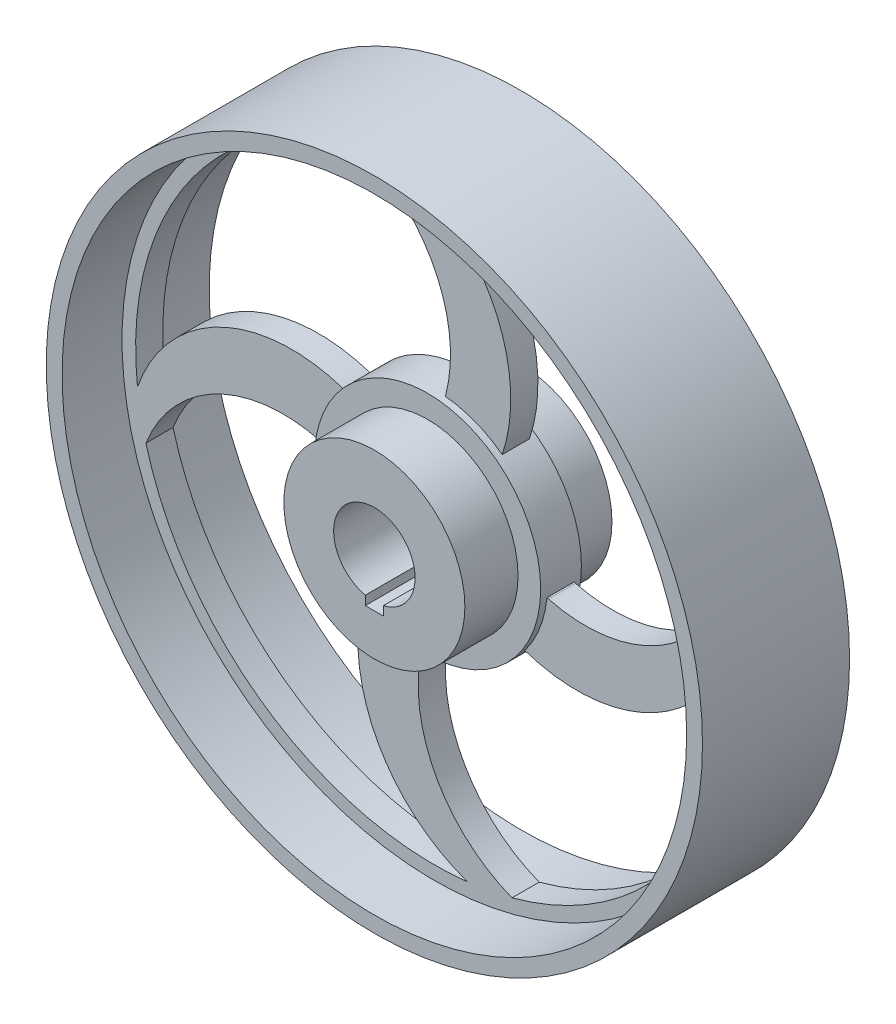
ISO-10303-21;
HEADER;
FILE_DESCRIPTION(('STEP AP214'),'2;1');
FILE_NAME('part.step','',(''),(''),'','','');
FILE_SCHEMA(('AUTOMOTIVE_DESIGN { 1 0 10303 214 1 1 1 1 }'));
ENDSEC;
DATA;
#1=APPLICATION_CONTEXT('core data for automotive mechanical design processes');
#2=APPLICATION_PROTOCOL_DEFINITION('international standard','automotive_design',2000,#1);
#3=PRODUCT_CONTEXT('',#1,'mechanical');
#4=PRODUCT('Part','Part','',(#3));
#5=PRODUCT_RELATED_PRODUCT_CATEGORY('part','',(#4));
#6=PRODUCT_DEFINITION_FORMATION('','',#4);
#7=PRODUCT_DEFINITION_CONTEXT('part definition',#1,'design');
#8=PRODUCT_DEFINITION('design','',#6,#7);
#9=PRODUCT_DEFINITION_SHAPE('','',#8);
#10=(LENGTH_UNIT() NAMED_UNIT(*) SI_UNIT(.MILLI.,.METRE.));
#11=(NAMED_UNIT(*) PLANE_ANGLE_UNIT() SI_UNIT($,.RADIAN.));
#12=(NAMED_UNIT(*) SI_UNIT($,.STERADIAN.) SOLID_ANGLE_UNIT());
#13=UNCERTAINTY_MEASURE_WITH_UNIT(LENGTH_MEASURE(1.E-05),#10,'distance_accuracy_value','');
#14=(GEOMETRIC_REPRESENTATION_CONTEXT(3) GLOBAL_UNCERTAINTY_ASSIGNED_CONTEXT((#13)) GLOBAL_UNIT_ASSIGNED_CONTEXT((#10,
#11,#12)) REPRESENTATION_CONTEXT('',''));
#15=CARTESIAN_POINT('',(0.,0.,0.));
#16=DIRECTION('',(0.,0.,1.));
#17=DIRECTION('',(1.,0.,0.));
#18=AXIS2_PLACEMENT_3D('',#15,#16,#17);
#19=CARTESIAN_POINT('',(0.,0.,152.4));
#20=DIRECTION('',(0.,0.,-1.));
#21=DIRECTION('',(-1.,0.,0.));
#22=AXIS2_PLACEMENT_3D('',#19,#20,#21);
#23=CYLINDRICAL_SURFACE('',#22,3352.8);
#24=CARTESIAN_POINT('',(0.,0.,152.4));
#25=DIRECTION('',(0.,0.,1.));
#26=DIRECTION('',(1.,0.,0.));
#27=AXIS2_PLACEMENT_3D('',#24,#25,#26);
#28=CIRCLE('',#27,3352.8);
#29=CARTESIAN_POINT('',(-872.169182147377,3237.37374390298,152.4));
#30=VERTEX_POINT('',#29);
#31=CARTESIAN_POINT('',(-3331.98089738469,-373.05648293995,152.4));
#32=VERTEX_POINT('',#31);
#33=EDGE_CURVE('E315',#30,#32,#28,.T.);
#34=ORIENTED_EDGE('',*,*,#33,.T.);
#35=DIRECTION('',(0.,0.,-1.));
#36=VECTOR('',#35,1.);
#37=CARTESIAN_POINT('',(-3331.98089738469,-373.05648293995,152.4));
#38=LINE('',#37,#36);
#39=CARTESIAN_POINT('',(-3331.98089738469,-373.05648293995,-152.4));
#40=VERTEX_POINT('',#39);
#41=EDGE_CURVE('E506',#32,#40,#38,.T.);
#42=ORIENTED_EDGE('',*,*,#41,.T.);
#43=CARTESIAN_POINT('',(0.,0.,-152.4));
#44=DIRECTION('',(0.,0.,1.));
#45=DIRECTION('',(1.,0.,0.));
#46=AXIS2_PLACEMENT_3D('',#43,#44,#45);
#47=CIRCLE('',#46,3352.8);
#48=CARTESIAN_POINT('',(-872.169182147377,3237.37374390298,-152.4));
#49=VERTEX_POINT('',#48);
#50=EDGE_CURVE('E321',#49,#40,#47,.T.);
#51=ORIENTED_EDGE('',*,*,#50,.F.);
#52=DIRECTION('',(0.,0.,-1.));
#53=VECTOR('',#52,1.);
#54=CARTESIAN_POINT('',(-872.169182147377,3237.37374390298,152.4));
#55=LINE('',#54,#53);
#56=EDGE_CURVE('E352',#30,#49,#55,.T.);
#57=ORIENTED_EDGE('',*,*,#56,.F.);
#58=EDGE_LOOP('',(#34,#42,#51,#57));
#59=FACE_BOUND('',#58,.T.);
#60=ADVANCED_FACE('F37',(#59),#23,.F.);
#61=CARTESIAN_POINT('',(-3237.37374390299,-872.169182147343,-152.4));
#62=VERTEX_POINT('',#61);
#63=CARTESIAN_POINT('',(373.05648293996,-3331.98089738469,-152.4));
#64=VERTEX_POINT('',#63);
#65=EDGE_CURVE('E323',#62,#64,#47,.T.);
#66=ORIENTED_EDGE('',*,*,#65,.F.);
#67=DIRECTION('',(0.,0.,-1.));
#68=VECTOR('',#67,1.);
#69=CARTESIAN_POINT('',(-3237.37374390299,-872.169182147343,152.4));
#70=LINE('',#69,#68);
#71=CARTESIAN_POINT('',(-3237.37374390299,-872.169182147343,152.4));
#72=VERTEX_POINT('',#71);
#73=EDGE_CURVE('E459',#72,#62,#70,.T.);
#74=ORIENTED_EDGE('',*,*,#73,.F.);
#75=CARTESIAN_POINT('',(373.05648293996,-3331.98089738469,152.4));
#76=VERTEX_POINT('',#75);
#77=EDGE_CURVE('E319',#72,#76,#28,.T.);
#78=ORIENTED_EDGE('',*,*,#77,.T.);
#79=DIRECTION('',(0.,0.,-1.));
#80=VECTOR('',#79,1.);
#81=CARTESIAN_POINT('',(373.05648293996,-3331.98089738469,152.4));
#82=LINE('',#81,#80);
#83=EDGE_CURVE('E222',#76,#64,#82,.T.);
#84=ORIENTED_EDGE('',*,*,#83,.T.);
#85=EDGE_LOOP('',(#66,#74,#78,#84));
#86=FACE_BOUND('',#85,.T.);
#87=ADVANCED_FACE('F423',(#86),#23,.F.);
#88=CARTESIAN_POINT('',(872.169182147354,-3237.37374390298,-152.4));
#89=VERTEX_POINT('',#88);
#90=CARTESIAN_POINT('',(3331.98089738469,373.056482939973,-152.4));
#91=VERTEX_POINT('',#90);
#92=EDGE_CURVE('E446',#89,#91,#47,.T.);
#93=ORIENTED_EDGE('',*,*,#92,.F.);
#94=DIRECTION('',(0.,0.,-1.));
#95=VECTOR('',#94,1.);
#96=CARTESIAN_POINT('',(872.169182147354,-3237.37374390298,152.4));
#97=LINE('',#96,#95);
#98=CARTESIAN_POINT('',(872.169182147354,-3237.37374390298,152.4));
#99=VERTEX_POINT('',#98);
#100=EDGE_CURVE('E235',#99,#89,#97,.T.);
#101=ORIENTED_EDGE('',*,*,#100,.F.);
#102=CARTESIAN_POINT('',(3331.98089738469,373.056482939973,152.4));
#103=VERTEX_POINT('',#102);
#104=EDGE_CURVE('E461',#99,#103,#28,.T.);
#105=ORIENTED_EDGE('',*,*,#104,.T.);
#106=DIRECTION('',(0.,0.,-1.));
#107=VECTOR('',#106,1.);
#108=CARTESIAN_POINT('',(3331.98089738469,373.056482939973,152.4));
#109=LINE('',#108,#107);
#110=EDGE_CURVE('E267',#103,#91,#109,.T.);
#111=ORIENTED_EDGE('',*,*,#110,.T.);
#112=EDGE_LOOP('',(#93,#101,#105,#111));
#113=FACE_BOUND('',#112,.T.);
#114=ADVANCED_FACE('F430',(#113),#23,.F.);
#115=CARTESIAN_POINT('',(3237.37374390298,872.169182147366,-152.4));
#116=VERTEX_POINT('',#115);
#117=CARTESIAN_POINT('',(-373.056482939985,3331.98089738468,-152.4));
#118=VERTEX_POINT('',#117);
#119=EDGE_CURVE('E314',#116,#118,#47,.T.);
#120=ORIENTED_EDGE('',*,*,#119,.F.);
#121=DIRECTION('',(0.,0.,-1.));
#122=VECTOR('',#121,1.);
#123=CARTESIAN_POINT('',(3237.37374390298,872.169182147366,152.4));
#124=LINE('',#123,#122);
#125=CARTESIAN_POINT('',(3237.37374390298,872.169182147366,152.4));
#126=VERTEX_POINT('',#125);
#127=EDGE_CURVE('E270',#126,#116,#124,.T.);
#128=ORIENTED_EDGE('',*,*,#127,.F.);
#129=CARTESIAN_POINT('',(-373.056482939985,3331.98089738468,152.4));
#130=VERTEX_POINT('',#129);
#131=EDGE_CURVE('E320',#126,#130,#28,.T.);
#132=ORIENTED_EDGE('',*,*,#131,.T.);
#133=DIRECTION('',(0.,0.,-1.));
#134=VECTOR('',#133,1.);
#135=CARTESIAN_POINT('',(-373.056482939985,3331.98089738468,152.4));
#136=LINE('',#135,#134);
#137=EDGE_CURVE('E355',#130,#118,#136,.T.);
#138=ORIENTED_EDGE('',*,*,#137,.T.);
#139=EDGE_LOOP('',(#120,#128,#132,#138));
#140=FACE_BOUND('',#139,.T.);
#141=ADVANCED_FACE('F426',(#140),#23,.F.);
#142=CARTESIAN_POINT('',(0.,0.,228.6));
#143=DIRECTION('',(0.,0.,-1.));
#144=DIRECTION('',(-1.,0.,0.));
#145=AXIS2_PLACEMENT_3D('',#142,#143,#144);
#146=CYLINDRICAL_SURFACE('',#145,1270.);
#147=DIRECTION('',(0.,0.,-1.));
#148=VECTOR('',#147,1.);
#149=CARTESIAN_POINT('',(-1015.99999999999,762.00000000001,152.4));
#150=LINE('',#149,#148);
#151=CARTESIAN_POINT('',(-1015.99999999999,762.00000000001,152.4));
#152=VERTEX_POINT('',#151);
#153=CARTESIAN_POINT('',(-1015.99999999999,762.000000000011,-152.4));
#154=VERTEX_POINT('',#153);
#155=EDGE_CURVE('E52',#152,#154,#150,.T.);
#156=ORIENTED_EDGE('',*,*,#155,.F.);
#157=CARTESIAN_POINT('',(-8.88178419700125E-13,0.,152.4));
#158=DIRECTION('',(0.,0.,-1.));
#159=DIRECTION('',(1.,0.,0.));
#160=AXIS2_PLACEMENT_3D('',#157,#158,#159);
#161=CIRCLE('',#160,1270.);
#162=CARTESIAN_POINT('',(-1263.93009157304,124.019045376743,152.4));
#163=VERTEX_POINT('',#162);
#164=EDGE_CURVE('E57',#163,#152,#161,.T.);
#165=ORIENTED_EDGE('',*,*,#164,.F.);
#166=DIRECTION('',(0.,0.,-1.));
#167=VECTOR('',#166,1.);
#168=CARTESIAN_POINT('',(-1263.93009157304,124.019045376743,152.4));
#169=LINE('',#168,#167);
#170=CARTESIAN_POINT('',(-1263.93009157304,124.019045376743,-152.4));
#171=VERTEX_POINT('',#170);
#172=EDGE_CURVE('E195',#163,#171,#169,.T.);
#173=ORIENTED_EDGE('',*,*,#172,.T.);
#174=CARTESIAN_POINT('',(-8.88178419700125E-13,0.,-152.4));
#175=DIRECTION('',(0.,0.,-1.));
#176=DIRECTION('',(1.,0.,0.));
#177=AXIS2_PLACEMENT_3D('',#174,#175,#176);
#178=CIRCLE('',#177,1270.);
#179=EDGE_CURVE('E199',#171,#154,#178,.T.);
#180=ORIENTED_EDGE('',*,*,#179,.T.);
#181=EDGE_LOOP('',(#156,#165,#173,#180));
#182=FACE_BOUND('',#181,.T.);
#183=DIRECTION('',(0.,0.,-1.));
#184=VECTOR('',#183,1.);
#185=CARTESIAN_POINT('',(-762.000000000007,-1015.99999999999,152.4));
#186=LINE('',#185,#184);
#187=CARTESIAN_POINT('',(-762.000000000007,-1015.99999999999,152.4));
#188=VERTEX_POINT('',#187);
#189=CARTESIAN_POINT('',(-762.000000000008,-1015.99999999999,-152.4));
#190=VERTEX_POINT('',#189);
#191=EDGE_CURVE('E219',#188,#190,#186,.T.);
#192=ORIENTED_EDGE('',*,*,#191,.F.);
#193=CARTESIAN_POINT('',(-8.88178419700125E-13,0.,152.4));
#194=DIRECTION('',(0.,0.,-1.));
#195=DIRECTION('',(1.,0.,0.));
#196=AXIS2_PLACEMENT_3D('',#193,#194,#195);
#197=CIRCLE('',#196,1270.);
#198=CARTESIAN_POINT('',(-124.019045376738,-1263.93009157304,152.4));
#199=VERTEX_POINT('',#198);
#200=EDGE_CURVE('E248',#199,#188,#197,.T.);
#201=ORIENTED_EDGE('',*,*,#200,.F.);
#202=DIRECTION('',(0.,0.,-1.));
#203=VECTOR('',#202,1.);
#204=CARTESIAN_POINT('',(-124.019045376738,-1263.93009157304,152.4));
#205=LINE('',#204,#203);
#206=CARTESIAN_POINT('',(-124.019045376738,-1263.93009157304,-152.4));
#207=VERTEX_POINT('',#206);
#208=EDGE_CURVE('E241',#199,#207,#205,.T.);
#209=ORIENTED_EDGE('',*,*,#208,.T.);
#210=CARTESIAN_POINT('',(-8.88178419700125E-13,0.,-152.4));
#211=DIRECTION('',(0.,0.,-1.));
#212=DIRECTION('',(1.,0.,0.));
#213=AXIS2_PLACEMENT_3D('',#210,#211,#212);
#214=CIRCLE('',#213,1270.);
#215=EDGE_CURVE('E253',#207,#190,#214,.T.);
#216=ORIENTED_EDGE('',*,*,#215,.T.);
#217=EDGE_LOOP('',(#192,#201,#209,#216));
#218=FACE_BOUND('',#217,.T.);
#219=DIRECTION('',(0.,0.,-1.));
#220=VECTOR('',#219,1.);
#221=CARTESIAN_POINT('',(1016.,-762.000000000004,152.4));
#222=LINE('',#221,#220);
#223=CARTESIAN_POINT('',(1016.,-762.000000000004,152.4));
#224=VERTEX_POINT('',#223);
#225=CARTESIAN_POINT('',(1016.,-762.000000000004,-152.4));
#226=VERTEX_POINT('',#225);
#227=EDGE_CURVE('E255',#224,#226,#222,.T.);
#228=ORIENTED_EDGE('',*,*,#227,.F.);
#229=CARTESIAN_POINT('',(-8.88178419700125E-13,0.,152.4));
#230=DIRECTION('',(0.,0.,-1.));
#231=DIRECTION('',(1.,0.,0.));
#232=AXIS2_PLACEMENT_3D('',#229,#230,#231);
#233=CIRCLE('',#232,1270.);
#234=CARTESIAN_POINT('',(1263.93009157304,-124.019045376734,152.4));
#235=VERTEX_POINT('',#234);
#236=EDGE_CURVE('E283',#235,#224,#233,.T.);
#237=ORIENTED_EDGE('',*,*,#236,.F.);
#238=DIRECTION('',(0.,0.,-1.));
#239=VECTOR('',#238,1.);
#240=CARTESIAN_POINT('',(1263.93009157304,-124.019045376734,152.4));
#241=LINE('',#240,#239);
#242=CARTESIAN_POINT('',(1263.93009157304,-124.019045376734,-152.4));
#243=VERTEX_POINT('',#242);
#244=EDGE_CURVE('E276',#235,#243,#241,.T.);
#245=ORIENTED_EDGE('',*,*,#244,.T.);
#246=CARTESIAN_POINT('',(-8.88178419700125E-13,0.,-152.4));
#247=DIRECTION('',(0.,0.,-1.));
#248=DIRECTION('',(1.,0.,0.));
#249=AXIS2_PLACEMENT_3D('',#246,#247,#248);
#250=CIRCLE('',#249,1270.);
#251=EDGE_CURVE('E288',#243,#226,#250,.T.);
#252=ORIENTED_EDGE('',*,*,#251,.T.);
#253=EDGE_LOOP('',(#228,#237,#245,#252));
#254=FACE_BOUND('',#253,.T.);
#255=DIRECTION('',(0.,0.,-1.));
#256=VECTOR('',#255,1.);
#257=CARTESIAN_POINT('',(762.,1016.,152.4));
#258=LINE('',#257,#256);
#259=CARTESIAN_POINT('',(762.,1016.,152.4));
#260=VERTEX_POINT('',#259);
#261=CARTESIAN_POINT('',(762.,1016.,-152.4));
#262=VERTEX_POINT('',#261);
#263=EDGE_CURVE('E358',#260,#262,#258,.T.);
#264=ORIENTED_EDGE('',*,*,#263,.F.);
#265=CARTESIAN_POINT('',(-8.88178419700125E-13,0.,152.4));
#266=DIRECTION('',(0.,0.,-1.));
#267=DIRECTION('',(1.,0.,0.));
#268=AXIS2_PLACEMENT_3D('',#265,#266,#267);
#269=CIRCLE('',#268,1270.);
#270=CARTESIAN_POINT('',(124.01904537673,1263.93009157304,152.4));
#271=VERTEX_POINT('',#270);
#272=EDGE_CURVE('E327',#271,#260,#269,.T.);
#273=ORIENTED_EDGE('',*,*,#272,.F.);
#274=DIRECTION('',(0.,0.,-1.));
#275=VECTOR('',#274,1.);
#276=CARTESIAN_POINT('',(124.01904537673,1263.93009157304,152.4));
#277=LINE('',#276,#275);
#278=CARTESIAN_POINT('',(124.01904537673,1263.93009157304,-152.4));
#279=VERTEX_POINT('',#278);
#280=EDGE_CURVE('E339',#271,#279,#277,.T.);
#281=ORIENTED_EDGE('',*,*,#280,.T.);
#282=CARTESIAN_POINT('',(-8.88178419700125E-13,0.,-152.4));
#283=DIRECTION('',(0.,0.,-1.));
#284=DIRECTION('',(1.,0.,0.));
#285=AXIS2_PLACEMENT_3D('',#282,#283,#284);
#286=CIRCLE('',#285,1270.);
#287=EDGE_CURVE('E326',#279,#262,#286,.T.);
#288=ORIENTED_EDGE('',*,*,#287,.T.);
#289=EDGE_LOOP('',(#264,#273,#281,#288));
#290=FACE_BOUND('',#289,.T.);
#291=CARTESIAN_POINT('',(0.,0.,228.6));
#292=DIRECTION('',(0.,0.,1.));
#293=DIRECTION('',(1.,0.,0.));
#294=AXIS2_PLACEMENT_3D('',#291,#292,#293);
#295=CIRCLE('',#294,1270.);
#296=CARTESIAN_POINT('',(1270.,0.,228.6));
#297=VERTEX_POINT('',#296);
#298=EDGE_CURVE('E45',#297,#297,#295,.T.);
#299=ORIENTED_EDGE('',*,*,#298,.F.);
#300=EDGE_LOOP('',(#299));
#301=FACE_BOUND('',#300,.T.);
#302=CARTESIAN_POINT('',(0.,0.,-228.6));
#303=DIRECTION('',(0.,0.,1.));
#304=DIRECTION('',(1.,0.,0.));
#305=AXIS2_PLACEMENT_3D('',#302,#303,#304);
#306=CIRCLE('',#305,1270.);
#307=CARTESIAN_POINT('',(1270.,0.,-228.6));
#308=VERTEX_POINT('',#307);
#309=EDGE_CURVE('E401',#308,#308,#306,.T.);
#310=ORIENTED_EDGE('',*,*,#309,.T.);
#311=EDGE_LOOP('',(#310));
#312=FACE_BOUND('',#311,.T.);
#313=ADVANCED_FACE('F39',(#182,#218,#254,#290,#301,#312),#146,.T.);
#314=CARTESIAN_POINT('',(0.,0.,228.6));
#315=DIRECTION('',(0.,0.,1.));
#316=DIRECTION('',(1.,0.,0.));
#317=AXIS2_PLACEMENT_3D('',#314,#315,#316);
#318=PLANE('',#317);
#319=CARTESIAN_POINT('',(0.,0.,228.6));
#320=DIRECTION('',(0.,0.,1.));
#321=DIRECTION('',(1.,0.,0.));
#322=AXIS2_PLACEMENT_3D('',#319,#320,#321);
#323=CIRCLE('',#322,1016.);
#324=CARTESIAN_POINT('',(1016.,0.,228.6));
#325=VERTEX_POINT('',#324);
#326=EDGE_CURVE('E396',#325,#325,#323,.F.);
#327=ORIENTED_EDGE('',*,*,#326,.T.);
#328=EDGE_LOOP('',(#327));
#329=FACE_BOUND('',#328,.T.);
#330=ORIENTED_EDGE('',*,*,#298,.T.);
#331=EDGE_LOOP('',(#330));
#332=FACE_BOUND('',#331,.T.);
#333=ADVANCED_FACE('F410',(#329,#332),#318,.T.);
#334=CARTESIAN_POINT('',(0.,0.,-228.6));
#335=DIRECTION('',(0.,0.,1.));
#336=DIRECTION('',(1.,0.,0.));
#337=AXIS2_PLACEMENT_3D('',#334,#335,#336);
#338=PLANE('',#337);
#339=CARTESIAN_POINT('',(0.,0.,-228.6));
#340=DIRECTION('',(0.,0.,1.));
#341=DIRECTION('',(1.,0.,0.));
#342=AXIS2_PLACEMENT_3D('',#339,#340,#341);
#343=CIRCLE('',#342,1016.);
#344=CARTESIAN_POINT('',(1016.,0.,-228.6));
#345=VERTEX_POINT('',#344);
#346=EDGE_CURVE('E11',#345,#345,#343,.F.);
#347=ORIENTED_EDGE('',*,*,#346,.F.);
#348=EDGE_LOOP('',(#347));
#349=FACE_BOUND('',#348,.T.);
#350=ORIENTED_EDGE('',*,*,#309,.F.);
#351=EDGE_LOOP('',(#350));
#352=FACE_BOUND('',#351,.T.);
#353=ADVANCED_FACE('F407',(#349,#352),#338,.F.);
#354=CARTESIAN_POINT('',(0.,0.,-825.5));
#355=DIRECTION('',(0.,0.,1.));
#356=DIRECTION('',(1.,0.,0.));
#357=AXIS2_PLACEMENT_3D('',#354,#355,#356);
#358=PLANE('',#357);
#359=DIRECTION('',(-1.,0.,0.));
#360=VECTOR('',#359,1.);
#361=CARTESIAN_POINT('',(101.6,-547.36819087952,-825.5));
#362=LINE('',#361,#360);
#363=CARTESIAN_POINT('',(101.6,-547.36819087952,-825.5));
#364=VERTEX_POINT('',#363);
#365=CARTESIAN_POINT('',(-101.6,-547.36819087952,-825.5));
#366=VERTEX_POINT('',#365);
#367=EDGE_CURVE('E372',#364,#366,#362,.T.);
#368=ORIENTED_EDGE('',*,*,#367,.F.);
#369=DIRECTION('',(0.,1.,0.));
#370=VECTOR('',#369,1.);
#371=CARTESIAN_POINT('',(101.6,-547.36819087952,-825.5));
#372=LINE('',#371,#370);
#373=CARTESIAN_POINT('',(101.6,-445.76819087952,-825.5));
#374=VERTEX_POINT('',#373);
#375=EDGE_CURVE('E362',#364,#374,#372,.T.);
#376=ORIENTED_EDGE('',*,*,#375,.T.);
#377=CARTESIAN_POINT('',(0.,0.,-825.5));
#378=DIRECTION('',(0.,0.,1.));
#379=DIRECTION('',(1.,0.,0.));
#380=AXIS2_PLACEMENT_3D('',#377,#378,#379);
#381=CIRCLE('',#380,457.2);
#382=CARTESIAN_POINT('',(-101.600000000001,-445.76819087952,-825.5));
#383=VERTEX_POINT('',#382);
#384=EDGE_CURVE('E365',#374,#383,#381,.T.);
#385=ORIENTED_EDGE('',*,*,#384,.T.);
#386=DIRECTION('',(0.,1.,0.));
#387=VECTOR('',#386,1.);
#388=CARTESIAN_POINT('',(-101.6,-547.36819087952,-825.5));
#389=LINE('',#388,#387);
#390=EDGE_CURVE('E369',#366,#383,#389,.T.);
#391=ORIENTED_EDGE('',*,*,#390,.F.);
#392=EDGE_LOOP('',(#368,#376,#385,#391));
#393=FACE_BOUND('',#392,.T.);
#394=CARTESIAN_POINT('',(0.,0.,-825.5));
#395=DIRECTION('',(0.,0.,1.));
#396=DIRECTION('',(1.,0.,0.));
#397=AXIS2_PLACEMENT_3D('',#394,#395,#396);
#398=CIRCLE('',#397,1016.);
#399=CARTESIAN_POINT('',(1016.,0.,-825.5));
#400=VERTEX_POINT('',#399);
#401=EDGE_CURVE('E386',#400,#400,#398,.T.);
#402=ORIENTED_EDGE('',*,*,#401,.F.);
#403=EDGE_LOOP('',(#402));
#404=FACE_BOUND('',#403,.T.);
#405=ADVANCED_FACE('F409',(#393,#404),#358,.F.);
#406=CARTESIAN_POINT('',(0.,0.,825.5));
#407=DIRECTION('',(0.,0.,-1.));
#408=DIRECTION('',(-1.,0.,0.));
#409=AXIS2_PLACEMENT_3D('',#406,#407,#408);
#410=CYLINDRICAL_SURFACE('',#409,1016.);
#411=ORIENTED_EDGE('',*,*,#401,.T.);
#412=EDGE_LOOP('',(#411));
#413=FACE_BOUND('',#412,.T.);
#414=ORIENTED_EDGE('',*,*,#346,.T.);
#415=EDGE_LOOP('',(#414));
#416=FACE_BOUND('',#415,.T.);
#417=ADVANCED_FACE('F416',(#413,#416),#410,.T.);
#418=ORIENTED_EDGE('',*,*,#326,.F.);
#419=EDGE_LOOP('',(#418));
#420=FACE_BOUND('',#419,.T.);
#421=CARTESIAN_POINT('',(0.,0.,825.5));
#422=DIRECTION('',(0.,0.,1.));
#423=DIRECTION('',(1.,0.,0.));
#424=AXIS2_PLACEMENT_3D('',#421,#422,#423);
#425=CIRCLE('',#424,1016.);
#426=CARTESIAN_POINT('',(1016.,0.,825.5));
#427=VERTEX_POINT('',#426);
#428=EDGE_CURVE('E393',#427,#427,#425,.T.);
#429=ORIENTED_EDGE('',*,*,#428,.F.);
#430=EDGE_LOOP('',(#429));
#431=FACE_BOUND('',#430,.T.);
#432=ADVANCED_FACE('F592',(#420,#431),#410,.T.);
#433=CARTESIAN_POINT('',(0.,0.,825.5));
#434=DIRECTION('',(0.,0.,1.));
#435=DIRECTION('',(1.,0.,0.));
#436=AXIS2_PLACEMENT_3D('',#433,#434,#435);
#437=PLANE('',#436);
#438=DIRECTION('',(0.,1.,0.));
#439=VECTOR('',#438,1.);
#440=CARTESIAN_POINT('',(101.6,-547.36819087952,825.5));
#441=LINE('',#440,#439);
#442=CARTESIAN_POINT('',(101.6,-547.36819087952,825.5));
#443=VERTEX_POINT('',#442);
#444=CARTESIAN_POINT('',(101.6,-445.76819087952,825.5));
#445=VERTEX_POINT('',#444);
#446=EDGE_CURVE('E361',#443,#445,#441,.T.);
#447=ORIENTED_EDGE('',*,*,#446,.F.);
#448=DIRECTION('',(-1.,0.,0.));
#449=VECTOR('',#448,1.);
#450=CARTESIAN_POINT('',(101.6,-547.36819087952,825.5));
#451=LINE('',#450,#449);
#452=CARTESIAN_POINT('',(-101.6,-547.36819087952,825.5));
#453=VERTEX_POINT('',#452);
#454=EDGE_CURVE('E366',#443,#453,#451,.T.);
#455=ORIENTED_EDGE('',*,*,#454,.T.);
#456=DIRECTION('',(0.,1.,0.));
#457=VECTOR('',#456,1.);
#458=CARTESIAN_POINT('',(-101.6,-547.36819087952,825.5));
#459=LINE('',#458,#457);
#460=CARTESIAN_POINT('',(-101.600000000001,-445.76819087952,825.5));
#461=VERTEX_POINT('',#460);
#462=EDGE_CURVE('E379',#453,#461,#459,.T.);
#463=ORIENTED_EDGE('',*,*,#462,.T.);
#464=CARTESIAN_POINT('',(0.,0.,825.5));
#465=DIRECTION('',(0.,0.,1.));
#466=DIRECTION('',(1.,0.,0.));
#467=AXIS2_PLACEMENT_3D('',#464,#465,#466);
#468=CIRCLE('',#467,457.2);
#469=EDGE_CURVE('E376',#445,#461,#468,.T.);
#470=ORIENTED_EDGE('',*,*,#469,.F.);
#471=EDGE_LOOP('',(#447,#455,#463,#470));
#472=FACE_BOUND('',#471,.T.);
#473=ORIENTED_EDGE('',*,*,#428,.T.);
#474=EDGE_LOOP('',(#473));
#475=FACE_BOUND('',#474,.T.);
#476=ADVANCED_FACE('F589',(#472,#475),#437,.T.);
#477=CARTESIAN_POINT('',(101.6,-547.36819087952,-825.5));
#478=DIRECTION('',(1.,0.,0.));
#479=DIRECTION('',(0.,1.,0.));
#480=AXIS2_PLACEMENT_3D('',#477,#478,#479);
#481=PLANE('',#480);
#482=ORIENTED_EDGE('',*,*,#446,.T.);
#483=DIRECTION('',(0.,0.,1.));
#484=VECTOR('',#483,1.);
#485=CARTESIAN_POINT('',(101.6,-445.76819087952,-825.5));
#486=LINE('',#485,#484);
#487=EDGE_CURVE('E374',#374,#445,#486,.T.);
#488=ORIENTED_EDGE('',*,*,#487,.F.);
#489=ORIENTED_EDGE('',*,*,#375,.F.);
#490=DIRECTION('',(0.,0.,1.));
#491=VECTOR('',#490,1.);
#492=CARTESIAN_POINT('',(101.6,-547.36819087952,-825.5));
#493=LINE('',#492,#491);
#494=EDGE_CURVE('E384',#364,#443,#493,.T.);
#495=ORIENTED_EDGE('',*,*,#494,.T.);
#496=EDGE_LOOP('',(#482,#488,#489,#495));
#497=FACE_BOUND('',#496,.T.);
#498=ADVANCED_FACE('F579',(#497),#481,.F.);
#499=CARTESIAN_POINT('',(101.6,-547.36819087952,-825.5));
#500=DIRECTION('',(0.,1.,0.));
#501=DIRECTION('',(-1.,0.,0.));
#502=AXIS2_PLACEMENT_3D('',#499,#500,#501);
#503=PLANE('',#502);
#504=ORIENTED_EDGE('',*,*,#454,.F.);
#505=ORIENTED_EDGE('',*,*,#494,.F.);
#506=ORIENTED_EDGE('',*,*,#367,.T.);
#507=DIRECTION('',(0.,0.,1.));
#508=VECTOR('',#507,1.);
#509=CARTESIAN_POINT('',(-101.6,-547.36819087952,-825.5));
#510=LINE('',#509,#508);
#511=EDGE_CURVE('E387',#366,#453,#510,.T.);
#512=ORIENTED_EDGE('',*,*,#511,.T.);
#513=EDGE_LOOP('',(#504,#505,#506,#512));
#514=FACE_BOUND('',#513,.T.);
#515=ADVANCED_FACE('F575',(#514),#503,.T.);
#516=CARTESIAN_POINT('',(-101.6,-547.36819087952,-825.5));
#517=DIRECTION('',(1.,0.,0.));
#518=DIRECTION('',(0.,1.,0.));
#519=AXIS2_PLACEMENT_3D('',#516,#517,#518);
#520=PLANE('',#519);
#521=ORIENTED_EDGE('',*,*,#462,.F.);
#522=ORIENTED_EDGE('',*,*,#511,.F.);
#523=ORIENTED_EDGE('',*,*,#390,.T.);
#524=DIRECTION('',(0.,0.,1.));
#525=VECTOR('',#524,1.);
#526=CARTESIAN_POINT('',(-101.600000000001,-445.76819087952,-825.5));
#527=LINE('',#526,#525);
#528=EDGE_CURVE('E389',#383,#461,#527,.T.);
#529=ORIENTED_EDGE('',*,*,#528,.T.);
#530=EDGE_LOOP('',(#521,#522,#523,#529));
#531=FACE_BOUND('',#530,.T.);
#532=ADVANCED_FACE('F578',(#531),#520,.T.);
#533=CARTESIAN_POINT('',(0.,0.,-825.5));
#534=DIRECTION('',(0.,0.,1.));
#535=DIRECTION('',(1.,0.,0.));
#536=AXIS2_PLACEMENT_3D('',#533,#534,#535);
#537=CYLINDRICAL_SURFACE('',#536,457.2);
#538=ORIENTED_EDGE('',*,*,#469,.T.);
#539=ORIENTED_EDGE('',*,*,#528,.F.);
#540=ORIENTED_EDGE('',*,*,#384,.F.);
#541=ORIENTED_EDGE('',*,*,#487,.T.);
#542=EDGE_LOOP('',(#538,#539,#540,#541));
#543=FACE_BOUND('',#542,.T.);
#544=ADVANCED_FACE('F574',(#543),#537,.F.);
#545=CARTESIAN_POINT('',(-974.188725536605,1601.23284939887,152.4));
#546=DIRECTION('',(0.,0.,-1.));
#547=DIRECTION('',(-1.,0.,0.));
#548=AXIS2_PLACEMENT_3D('',#545,#546,#547);
#549=CYLINDRICAL_SURFACE('',#548,1832.17051026807);
#550=CARTESIAN_POINT('',(-974.188725536605,1601.23284939887,-152.4));
#551=DIRECTION('',(0.,0.,1.));
#552=DIRECTION('',(-1.,0.,0.));
#553=AXIS2_PLACEMENT_3D('',#550,#551,#552);
#554=CIRCLE('',#553,1832.17051026807);
#555=EDGE_CURVE('E341',#262,#118,#554,.T.);
#556=ORIENTED_EDGE('',*,*,#555,.T.);
#557=ORIENTED_EDGE('',*,*,#137,.F.);
#558=CARTESIAN_POINT('',(-974.188725536605,1601.23284939887,152.4));
#559=DIRECTION('',(0.,0.,1.));
#560=DIRECTION('',(-1.,0.,0.));
#561=AXIS2_PLACEMENT_3D('',#558,#559,#560);
#562=CIRCLE('',#561,1832.17051026807);
#563=EDGE_CURVE('E330',#260,#130,#562,.T.);
#564=ORIENTED_EDGE('',*,*,#563,.F.);
#565=ORIENTED_EDGE('',*,*,#263,.T.);
#566=EDGE_LOOP('',(#556,#557,#564,#565));
#567=FACE_BOUND('',#566,.T.);
#568=ADVANCED_FACE('F491',(#567),#549,.T.);
#569=CARTESIAN_POINT('',(-1473.30134449858,1695.84042622503,152.4));
#570=DIRECTION('',(0.,0.,-1.));
#571=DIRECTION('',(-1.,0.,0.));
#572=AXIS2_PLACEMENT_3D('',#569,#570,#571);
#573=CYLINDRICAL_SURFACE('',#572,1654.59507013777);
#574=CARTESIAN_POINT('',(-1473.30134449858,1695.84042622503,-152.4));
#575=DIRECTION('',(0.,0.,-1.));
#576=DIRECTION('',(-1.,0.,0.));
#577=AXIS2_PLACEMENT_3D('',#574,#575,#576);
#578=CIRCLE('',#577,1654.59507013777);
#579=CARTESIAN_POINT('',(128.323732845128,1280.53095396613,-152.4));
#580=VERTEX_POINT('',#579);
#581=EDGE_CURVE('E344',#49,#580,#578,.T.);
#582=ORIENTED_EDGE('',*,*,#581,.T.);
#583=DIRECTION('',(0.,0.,-1.));
#584=VECTOR('',#583,1.);
#585=CARTESIAN_POINT('',(128.323732845128,1280.53095396613,152.4));
#586=LINE('',#585,#584);
#587=CARTESIAN_POINT('',(128.323732845128,1280.53095396613,152.4));
#588=VERTEX_POINT('',#587);
#589=EDGE_CURVE('E349',#588,#580,#586,.T.);
#590=ORIENTED_EDGE('',*,*,#589,.F.);
#591=CARTESIAN_POINT('',(-1473.30134449858,1695.84042622503,152.4));
#592=DIRECTION('',(0.,0.,-1.));
#593=DIRECTION('',(-1.,0.,0.));
#594=AXIS2_PLACEMENT_3D('',#591,#592,#593);
#595=CIRCLE('',#594,1654.59507013777);
#596=EDGE_CURVE('E334',#30,#588,#595,.T.);
#597=ORIENTED_EDGE('',*,*,#596,.F.);
#598=ORIENTED_EDGE('',*,*,#56,.T.);
#599=EDGE_LOOP('',(#582,#590,#597,#598));
#600=FACE_BOUND('',#599,.T.);
#601=ADVANCED_FACE('F500',(#600),#573,.F.);
#602=CARTESIAN_POINT('',(128.323732845128,1280.53095396613,152.4));
#603=DIRECTION('',(0.967986129204623,-0.251003692537483,0.));
#604=DIRECTION('',(0.251003692537483,0.967986129204623,0.));
#605=AXIS2_PLACEMENT_3D('',#602,#603,#604);
#606=PLANE('',#605);
#607=DIRECTION('',(-0.251003692537483,-0.967986129204623,0.));
#608=VECTOR('',#607,1.);
#609=CARTESIAN_POINT('',(128.323732845128,1280.53095396613,-152.4));
#610=LINE('',#609,#608);
#611=EDGE_CURVE('E331',#580,#279,#610,.T.);
#612=ORIENTED_EDGE('',*,*,#611,.T.);
#613=ORIENTED_EDGE('',*,*,#280,.F.);
#614=DIRECTION('',(-0.251003692537483,-0.967986129204623,0.));
#615=VECTOR('',#614,1.);
#616=CARTESIAN_POINT('',(128.323732845128,1280.53095396613,152.4));
#617=LINE('',#616,#615);
#618=EDGE_CURVE('E336',#588,#271,#617,.T.);
#619=ORIENTED_EDGE('',*,*,#618,.F.);
#620=ORIENTED_EDGE('',*,*,#589,.T.);
#621=EDGE_LOOP('',(#612,#613,#619,#620));
#622=FACE_BOUND('',#621,.T.);
#623=ADVANCED_FACE('F497',(#622),#606,.F.);
#624=CARTESIAN_POINT('',(-8.88178419700125E-13,0.,152.4));
#625=DIRECTION('',(0.,0.,1.));
#626=DIRECTION('',(1.,0.,0.));
#627=AXIS2_PLACEMENT_3D('',#624,#625,#626);
#628=PLANE('',#627);
#629=ORIENTED_EDGE('',*,*,#272,.T.);
#630=ORIENTED_EDGE('',*,*,#563,.T.);
#631=ORIENTED_EDGE('',*,*,#131,.F.);
#632=CARTESIAN_POINT('',(1695.84042622504,1473.30134449857,152.4));
#633=DIRECTION('',(0.,0.,-1.));
#634=DIRECTION('',(-1.,0.,0.));
#635=AXIS2_PLACEMENT_3D('',#632,#633,#634);
#636=CIRCLE('',#635,1654.59507013777);
#637=CARTESIAN_POINT('',(1280.53095396613,-128.323732845133,152.4));
#638=VERTEX_POINT('',#637);
#639=EDGE_CURVE('E293',#126,#638,#636,.T.);
#640=ORIENTED_EDGE('',*,*,#639,.T.);
#641=DIRECTION('',(-0.967986129204622,0.251003692537486,0.));
#642=VECTOR('',#641,1.);
#643=CARTESIAN_POINT('',(1280.53095396613,-128.323732845133,152.4));
#644=LINE('',#643,#642);
#645=EDGE_CURVE('E278',#638,#235,#644,.T.);
#646=ORIENTED_EDGE('',*,*,#645,.T.);
#647=ORIENTED_EDGE('',*,*,#236,.T.);
#648=CARTESIAN_POINT('',(1601.23284939888,974.188725536599,152.4));
#649=DIRECTION('',(0.,0.,1.));
#650=DIRECTION('',(-1.,0.,0.));
#651=AXIS2_PLACEMENT_3D('',#648,#649,#650);
#652=CIRCLE('',#651,1832.17051026807);
#653=EDGE_CURVE('E295',#224,#103,#652,.T.);
#654=ORIENTED_EDGE('',*,*,#653,.T.);
#655=ORIENTED_EDGE('',*,*,#104,.F.);
#656=CARTESIAN_POINT('',(1473.30134449857,-1695.84042622504,152.4));
#657=DIRECTION('',(0.,0.,-1.));
#658=DIRECTION('',(-1.,0.,0.));
#659=AXIS2_PLACEMENT_3D('',#656,#657,#658);
#660=CIRCLE('',#659,1654.59507013777);
#661=CARTESIAN_POINT('',(-128.323732845137,-1280.53095396613,152.4));
#662=VERTEX_POINT('',#661);
#663=EDGE_CURVE('E258',#99,#662,#660,.T.);
#664=ORIENTED_EDGE('',*,*,#663,.T.);
#665=DIRECTION('',(0.251003692537489,0.967986129204621,0.));
#666=VECTOR('',#665,1.);
#667=CARTESIAN_POINT('',(-128.323732845137,-1280.53095396613,152.4));
#668=LINE('',#667,#666);
#669=EDGE_CURVE('E243',#662,#199,#668,.T.);
#670=ORIENTED_EDGE('',*,*,#669,.T.);
#671=ORIENTED_EDGE('',*,*,#200,.T.);
#672=CARTESIAN_POINT('',(974.188725536593,-1601.23284939888,152.4));
#673=DIRECTION('',(0.,0.,1.));
#674=DIRECTION('',(-1.,0.,0.));
#675=AXIS2_PLACEMENT_3D('',#672,#673,#674);
#676=CIRCLE('',#675,1832.17051026807);
#677=EDGE_CURVE('E260',#188,#76,#676,.T.);
#678=ORIENTED_EDGE('',*,*,#677,.T.);
#679=ORIENTED_EDGE('',*,*,#77,.F.);
#680=CARTESIAN_POINT('',(-1695.84042622505,-1473.30134449856,152.4));
#681=DIRECTION('',(0.,0.,-1.));
#682=DIRECTION('',(-1.,0.,0.));
#683=AXIS2_PLACEMENT_3D('',#680,#681,#682);
#684=CIRCLE('',#683,1654.59507013777);
#685=CARTESIAN_POINT('',(-1280.53095396613,128.323732845142,152.4));
#686=VERTEX_POINT('',#685);
#687=EDGE_CURVE('E228',#72,#686,#684,.T.);
#688=ORIENTED_EDGE('',*,*,#687,.T.);
#689=DIRECTION('',(0.967986129204621,-0.251003692537492,0.));
#690=VECTOR('',#689,1.);
#691=CARTESIAN_POINT('',(-1280.53095396613,128.323732845142,152.4));
#692=LINE('',#691,#690);
#693=EDGE_CURVE('E203',#686,#163,#692,.T.);
#694=ORIENTED_EDGE('',*,*,#693,.T.);
#695=ORIENTED_EDGE('',*,*,#164,.T.);
#696=CARTESIAN_POINT('',(-1601.23284939888,-974.188725536588,152.4));
#697=DIRECTION('',(0.,0.,1.));
#698=DIRECTION('',(-1.,0.,0.));
#699=AXIS2_PLACEMENT_3D('',#696,#697,#698);
#700=CIRCLE('',#699,1832.17051026807);
#701=EDGE_CURVE('E230',#152,#32,#700,.T.);
#702=ORIENTED_EDGE('',*,*,#701,.T.);
#703=ORIENTED_EDGE('',*,*,#33,.F.);
#704=ORIENTED_EDGE('',*,*,#596,.T.);
#705=ORIENTED_EDGE('',*,*,#618,.T.);
#706=EDGE_LOOP('',(#629,#630,#631,#640,#646,#647,#654,#655,#664,#670,#671,#678,#679,#688,#694,
#695,#702,#703,#704,#705));
#707=FACE_BOUND('',#706,.T.);
#708=CARTESIAN_POINT('',(0.,0.,152.4));
#709=DIRECTION('',(0.,0.,1.));
#710=DIRECTION('',(1.,0.,0.));
#711=AXIS2_PLACEMENT_3D('',#708,#709,#710);
#712=CIRCLE('',#711,3505.2);
#713=CARTESIAN_POINT('',(3505.2,0.,152.4));
#714=VERTEX_POINT('',#713);
#715=EDGE_CURVE('E309',#714,#714,#712,.F.);
#716=ORIENTED_EDGE('',*,*,#715,.F.);
#717=EDGE_LOOP('',(#716));
#718=FACE_BOUND('',#717,.T.);
#719=ADVANCED_FACE('F462',(#707,#718),#628,.T.);
#720=CARTESIAN_POINT('',(-8.88178419700125E-13,0.,-152.4));
#721=DIRECTION('',(0.,0.,1.));
#722=DIRECTION('',(1.,0.,0.));
#723=AXIS2_PLACEMENT_3D('',#720,#721,#722);
#724=PLANE('',#723);
#725=ORIENTED_EDGE('',*,*,#287,.F.);
#726=ORIENTED_EDGE('',*,*,#611,.F.);
#727=ORIENTED_EDGE('',*,*,#581,.F.);
#728=ORIENTED_EDGE('',*,*,#50,.T.);
#729=CARTESIAN_POINT('',(-1601.23284939888,-974.188725536588,-152.4));
#730=DIRECTION('',(0.,0.,1.));
#731=DIRECTION('',(-1.,0.,0.));
#732=AXIS2_PLACEMENT_3D('',#729,#730,#731);
#733=CIRCLE('',#732,1832.17051026807);
#734=EDGE_CURVE('E218',#154,#40,#733,.T.);
#735=ORIENTED_EDGE('',*,*,#734,.F.);
#736=ORIENTED_EDGE('',*,*,#179,.F.);
#737=DIRECTION('',(0.967986129204621,-0.251003692537492,0.));
#738=VECTOR('',#737,1.);
#739=CARTESIAN_POINT('',(-1280.53095396613,128.323732845142,-152.4));
#740=LINE('',#739,#738);
#741=CARTESIAN_POINT('',(-1280.53095396613,128.323732845142,-152.4));
#742=VERTEX_POINT('',#741);
#743=EDGE_CURVE('E208',#742,#171,#740,.T.);
#744=ORIENTED_EDGE('',*,*,#743,.F.);
#745=CARTESIAN_POINT('',(-1695.84042622505,-1473.30134449856,-152.4));
#746=DIRECTION('',(0.,0.,-1.));
#747=DIRECTION('',(-1.,0.,0.));
#748=AXIS2_PLACEMENT_3D('',#745,#746,#747);
#749=CIRCLE('',#748,1654.59507013777);
#750=EDGE_CURVE('E212',#62,#742,#749,.T.);
#751=ORIENTED_EDGE('',*,*,#750,.F.);
#752=ORIENTED_EDGE('',*,*,#65,.T.);
#753=CARTESIAN_POINT('',(974.188725536593,-1601.23284939888,-152.4));
#754=DIRECTION('',(0.,0.,1.));
#755=DIRECTION('',(-1.,0.,0.));
#756=AXIS2_PLACEMENT_3D('',#753,#754,#755);
#757=CIRCLE('',#756,1832.17051026807);
#758=EDGE_CURVE('E250',#190,#64,#757,.T.);
#759=ORIENTED_EDGE('',*,*,#758,.F.);
#760=ORIENTED_EDGE('',*,*,#215,.F.);
#761=DIRECTION('',(0.251003692537489,0.967986129204621,0.));
#762=VECTOR('',#761,1.);
#763=CARTESIAN_POINT('',(-128.323732845137,-1280.53095396613,-152.4));
#764=LINE('',#763,#762);
#765=CARTESIAN_POINT('',(-128.323732845137,-1280.53095396613,-152.4));
#766=VERTEX_POINT('',#765);
#767=EDGE_CURVE('E244',#766,#207,#764,.T.);
#768=ORIENTED_EDGE('',*,*,#767,.F.);
#769=CARTESIAN_POINT('',(1473.30134449857,-1695.84042622504,-152.4));
#770=DIRECTION('',(0.,0.,-1.));
#771=DIRECTION('',(-1.,0.,0.));
#772=AXIS2_PLACEMENT_3D('',#769,#770,#771);
#773=CIRCLE('',#772,1654.59507013777);
#774=EDGE_CURVE('E247',#89,#766,#773,.T.);
#775=ORIENTED_EDGE('',*,*,#774,.F.);
#776=ORIENTED_EDGE('',*,*,#92,.T.);
#777=CARTESIAN_POINT('',(1601.23284939888,974.188725536599,-152.4));
#778=DIRECTION('',(0.,0.,1.));
#779=DIRECTION('',(-1.,0.,0.));
#780=AXIS2_PLACEMENT_3D('',#777,#778,#779);
#781=CIRCLE('',#780,1832.17051026807);
#782=EDGE_CURVE('E285',#226,#91,#781,.T.);
#783=ORIENTED_EDGE('',*,*,#782,.F.);
#784=ORIENTED_EDGE('',*,*,#251,.F.);
#785=DIRECTION('',(-0.967986129204622,0.251003692537486,0.));
#786=VECTOR('',#785,1.);
#787=CARTESIAN_POINT('',(1280.53095396613,-128.323732845133,-152.4));
#788=LINE('',#787,#786);
#789=CARTESIAN_POINT('',(1280.53095396613,-128.323732845133,-152.4));
#790=VERTEX_POINT('',#789);
#791=EDGE_CURVE('E279',#790,#243,#788,.T.);
#792=ORIENTED_EDGE('',*,*,#791,.F.);
#793=CARTESIAN_POINT('',(1695.84042622504,1473.30134449857,-152.4));
#794=DIRECTION('',(0.,0.,-1.));
#795=DIRECTION('',(-1.,0.,0.));
#796=AXIS2_PLACEMENT_3D('',#793,#794,#795);
#797=CIRCLE('',#796,1654.59507013777);
#798=EDGE_CURVE('E282',#116,#790,#797,.T.);
#799=ORIENTED_EDGE('',*,*,#798,.F.);
#800=ORIENTED_EDGE('',*,*,#119,.T.);
#801=ORIENTED_EDGE('',*,*,#555,.F.);
#802=EDGE_LOOP('',(#725,#726,#727,#728,#735,#736,#744,#751,#752,#759,#760,#768,#775,#776,#783,
#784,#792,#799,#800,#801));
#803=FACE_BOUND('',#802,.T.);
#804=CARTESIAN_POINT('',(0.,0.,-152.4));
#805=DIRECTION('',(0.,0.,1.));
#806=DIRECTION('',(1.,0.,0.));
#807=AXIS2_PLACEMENT_3D('',#804,#805,#806);
#808=CIRCLE('',#807,3505.2);
#809=CARTESIAN_POINT('',(3505.2,0.,-152.4));
#810=VERTEX_POINT('',#809);
#811=EDGE_CURVE('E318',#810,#810,#808,.T.);
#812=ORIENTED_EDGE('',*,*,#811,.F.);
#813=EDGE_LOOP('',(#812));
#814=FACE_BOUND('',#813,.T.);
#815=ADVANCED_FACE('F215',(#803,#814),#724,.F.);
#816=CARTESIAN_POINT('',(0.,0.,825.5));
#817=DIRECTION('',(0.,0.,-1.));
#818=DIRECTION('',(-1.,0.,0.));
#819=AXIS2_PLACEMENT_3D('',#816,#817,#818);
#820=CYLINDRICAL_SURFACE('',#819,3505.2);
#821=CARTESIAN_POINT('',(0.,0.,-825.5));
#822=DIRECTION('',(0.,0.,1.));
#823=DIRECTION('',(1.,0.,0.));
#824=AXIS2_PLACEMENT_3D('',#821,#822,#823);
#825=CIRCLE('',#824,3505.2);
#826=CARTESIAN_POINT('',(3505.2,0.,-825.5));
#827=VERTEX_POINT('',#826);
#828=EDGE_CURVE('E290',#827,#827,#825,.T.);
#829=ORIENTED_EDGE('',*,*,#828,.F.);
#830=EDGE_LOOP('',(#829));
#831=FACE_BOUND('',#830,.T.);
#832=ORIENTED_EDGE('',*,*,#811,.T.);
#833=EDGE_LOOP('',(#832));
#834=FACE_BOUND('',#833,.T.);
#835=ADVANCED_FACE('F541',(#831,#834),#820,.F.);
#836=CARTESIAN_POINT('',(0.,0.,825.5));
#837=DIRECTION('',(0.,0.,1.));
#838=DIRECTION('',(1.,0.,0.));
#839=AXIS2_PLACEMENT_3D('',#836,#837,#838);
#840=PLANE('',#839);
#841=CARTESIAN_POINT('',(0.,0.,825.5));
#842=DIRECTION('',(0.,0.,1.));
#843=DIRECTION('',(1.,0.,0.));
#844=AXIS2_PLACEMENT_3D('',#841,#842,#843);
#845=CIRCLE('',#844,3683.);
#846=CARTESIAN_POINT('',(3683.,0.,825.5));
#847=VERTEX_POINT('',#846);
#848=EDGE_CURVE('E306',#847,#847,#845,.T.);
#849=ORIENTED_EDGE('',*,*,#848,.T.);
#850=EDGE_LOOP('',(#849));
#851=FACE_BOUND('',#850,.T.);
#852=CARTESIAN_POINT('',(0.,0.,825.5));
#853=DIRECTION('',(0.,0.,1.));
#854=DIRECTION('',(1.,0.,0.));
#855=AXIS2_PLACEMENT_3D('',#852,#853,#854);
#856=CIRCLE('',#855,3505.2);
#857=CARTESIAN_POINT('',(3505.2,0.,825.5));
#858=VERTEX_POINT('',#857);
#859=EDGE_CURVE('E300',#858,#858,#856,.T.);
#860=ORIENTED_EDGE('',*,*,#859,.F.);
#861=EDGE_LOOP('',(#860));
#862=FACE_BOUND('',#861,.T.);
#863=ADVANCED_FACE('F542',(#851,#862),#840,.T.);
#864=CARTESIAN_POINT('',(0.,0.,-825.5));
#865=DIRECTION('',(0.,0.,1.));
#866=DIRECTION('',(1.,0.,0.));
#867=AXIS2_PLACEMENT_3D('',#864,#865,#866);
#868=PLANE('',#867);
#869=CARTESIAN_POINT('',(0.,0.,-825.5));
#870=DIRECTION('',(0.,0.,1.));
#871=DIRECTION('',(1.,0.,0.));
#872=AXIS2_PLACEMENT_3D('',#869,#870,#871);
#873=CIRCLE('',#872,3683.);
#874=CARTESIAN_POINT('',(3683.,0.,-825.5));
#875=VERTEX_POINT('',#874);
#876=EDGE_CURVE('E303',#875,#875,#873,.T.);
#877=ORIENTED_EDGE('',*,*,#876,.F.);
#878=EDGE_LOOP('',(#877));
#879=FACE_BOUND('',#878,.T.);
#880=ORIENTED_EDGE('',*,*,#828,.T.);
#881=EDGE_LOOP('',(#880));
#882=FACE_BOUND('',#881,.T.);
#883=ADVANCED_FACE('F545',(#879,#882),#868,.F.);
#884=CARTESIAN_POINT('',(0.,0.,825.5));
#885=DIRECTION('',(0.,0.,-1.));
#886=DIRECTION('',(-1.,0.,0.));
#887=AXIS2_PLACEMENT_3D('',#884,#885,#886);
#888=CYLINDRICAL_SURFACE('',#887,3683.);
#889=ORIENTED_EDGE('',*,*,#848,.F.);
#890=EDGE_LOOP('',(#889));
#891=FACE_BOUND('',#890,.T.);
#892=ORIENTED_EDGE('',*,*,#876,.T.);
#893=EDGE_LOOP('',(#892));
#894=FACE_BOUND('',#893,.T.);
#895=ADVANCED_FACE('F539',(#891,#894),#888,.T.);
#896=ORIENTED_EDGE('',*,*,#715,.T.);
#897=EDGE_LOOP('',(#896));
#898=FACE_BOUND('',#897,.T.);
#899=ORIENTED_EDGE('',*,*,#859,.T.);
#900=EDGE_LOOP('',(#899));
#901=FACE_BOUND('',#900,.T.);
#902=ADVANCED_FACE('F532',(#898,#901),#820,.F.);
#903=CARTESIAN_POINT('',(1601.23284939888,974.188725536599,152.4));
#904=DIRECTION('',(0.,0.,-1.));
#905=DIRECTION('',(-1.,0.,0.));
#906=AXIS2_PLACEMENT_3D('',#903,#904,#905);
#907=CYLINDRICAL_SURFACE('',#906,1832.17051026807);
#908=ORIENTED_EDGE('',*,*,#782,.T.);
#909=ORIENTED_EDGE('',*,*,#110,.F.);
#910=ORIENTED_EDGE('',*,*,#653,.F.);
#911=ORIENTED_EDGE('',*,*,#227,.T.);
#912=EDGE_LOOP('',(#908,#909,#910,#911));
#913=FACE_BOUND('',#912,.T.);
#914=ADVANCED_FACE('F478',(#913),#907,.T.);
#915=CARTESIAN_POINT('',(1695.84042622504,1473.30134449857,152.4));
#916=DIRECTION('',(0.,0.,-1.));
#917=DIRECTION('',(-1.,0.,0.));
#918=AXIS2_PLACEMENT_3D('',#915,#916,#917);
#919=CYLINDRICAL_SURFACE('',#918,1654.59507013777);
#920=ORIENTED_EDGE('',*,*,#798,.T.);
#921=DIRECTION('',(0.,0.,-1.));
#922=VECTOR('',#921,1.);
#923=CARTESIAN_POINT('',(1280.53095396613,-128.323732845133,152.4));
#924=LINE('',#923,#922);
#925=EDGE_CURVE('E273',#638,#790,#924,.T.);
#926=ORIENTED_EDGE('',*,*,#925,.F.);
#927=ORIENTED_EDGE('',*,*,#639,.F.);
#928=ORIENTED_EDGE('',*,*,#127,.T.);
#929=EDGE_LOOP('',(#920,#926,#927,#928));
#930=FACE_BOUND('',#929,.T.);
#931=ADVANCED_FACE('F488',(#930),#919,.F.);
#932=CARTESIAN_POINT('',(1280.53095396613,-128.323732845133,152.4));
#933=DIRECTION('',(-0.251003692537486,-0.967986129204622,0.));
#934=DIRECTION('',(0.967986129204622,-0.251003692537486,0.));
#935=AXIS2_PLACEMENT_3D('',#932,#933,#934);
#936=PLANE('',#935);
#937=ORIENTED_EDGE('',*,*,#791,.T.);
#938=ORIENTED_EDGE('',*,*,#244,.F.);
#939=ORIENTED_EDGE('',*,*,#645,.F.);
#940=ORIENTED_EDGE('',*,*,#925,.T.);
#941=EDGE_LOOP('',(#937,#938,#939,#940));
#942=FACE_BOUND('',#941,.T.);
#943=ADVANCED_FACE('F485',(#942),#936,.F.);
#944=CARTESIAN_POINT('',(974.188725536593,-1601.23284939888,152.4));
#945=DIRECTION('',(0.,0.,-1.));
#946=DIRECTION('',(-1.,0.,0.));
#947=AXIS2_PLACEMENT_3D('',#944,#945,#946);
#948=CYLINDRICAL_SURFACE('',#947,1832.17051026807);
#949=ORIENTED_EDGE('',*,*,#758,.T.);
#950=ORIENTED_EDGE('',*,*,#83,.F.);
#951=ORIENTED_EDGE('',*,*,#677,.F.);
#952=ORIENTED_EDGE('',*,*,#191,.T.);
#953=EDGE_LOOP('',(#949,#950,#951,#952));
#954=FACE_BOUND('',#953,.T.);
#955=ADVANCED_FACE('F456',(#954),#948,.T.);
#956=CARTESIAN_POINT('',(1473.30134449857,-1695.84042622504,152.4));
#957=DIRECTION('',(0.,0.,-1.));
#958=DIRECTION('',(-1.,0.,0.));
#959=AXIS2_PLACEMENT_3D('',#956,#957,#958);
#960=CYLINDRICAL_SURFACE('',#959,1654.59507013777);
#961=ORIENTED_EDGE('',*,*,#774,.T.);
#962=DIRECTION('',(0.,0.,-1.));
#963=VECTOR('',#962,1.);
#964=CARTESIAN_POINT('',(-128.323732845137,-1280.53095396613,152.4));
#965=LINE('',#964,#963);
#966=EDGE_CURVE('E238',#662,#766,#965,.T.);
#967=ORIENTED_EDGE('',*,*,#966,.F.);
#968=ORIENTED_EDGE('',*,*,#663,.F.);
#969=ORIENTED_EDGE('',*,*,#100,.T.);
#970=EDGE_LOOP('',(#961,#967,#968,#969));
#971=FACE_BOUND('',#970,.T.);
#972=ADVANCED_FACE('F472',(#971),#960,.F.);
#973=CARTESIAN_POINT('',(-128.323732845137,-1280.53095396613,152.4));
#974=DIRECTION('',(-0.967986129204621,0.251003692537489,0.));
#975=DIRECTION('',(-0.251003692537489,-0.967986129204621,0.));
#976=AXIS2_PLACEMENT_3D('',#973,#974,#975);
#977=PLANE('',#976);
#978=ORIENTED_EDGE('',*,*,#767,.T.);
#979=ORIENTED_EDGE('',*,*,#208,.F.);
#980=ORIENTED_EDGE('',*,*,#669,.F.);
#981=ORIENTED_EDGE('',*,*,#966,.T.);
#982=EDGE_LOOP('',(#978,#979,#980,#981));
#983=FACE_BOUND('',#982,.T.);
#984=ADVANCED_FACE('F469',(#983),#977,.F.);
#985=CARTESIAN_POINT('',(-1601.23284939888,-974.188725536588,152.4));
#986=DIRECTION('',(0.,0.,-1.));
#987=DIRECTION('',(-1.,0.,0.));
#988=AXIS2_PLACEMENT_3D('',#985,#986,#987);
#989=CYLINDRICAL_SURFACE('',#988,1832.17051026807);
#990=ORIENTED_EDGE('',*,*,#734,.T.);
#991=ORIENTED_EDGE('',*,*,#41,.F.);
#992=ORIENTED_EDGE('',*,*,#701,.F.);
#993=ORIENTED_EDGE('',*,*,#155,.T.);
#994=EDGE_LOOP('',(#990,#991,#992,#993));
#995=FACE_BOUND('',#994,.T.);
#996=ADVANCED_FACE('F514',(#995),#989,.T.);
#997=CARTESIAN_POINT('',(-1695.84042622505,-1473.30134449856,152.4));
#998=DIRECTION('',(0.,0.,-1.));
#999=DIRECTION('',(-1.,0.,0.));
#1000=AXIS2_PLACEMENT_3D('',#997,#998,#999);
#1001=CYLINDRICAL_SURFACE('',#1000,1654.59507013777);
#1002=ORIENTED_EDGE('',*,*,#750,.T.);
#1003=DIRECTION('',(0.,0.,-1.));
#1004=VECTOR('',#1003,1.);
#1005=CARTESIAN_POINT('',(-1280.53095396613,128.323732845142,152.4));
#1006=LINE('',#1005,#1004);
#1007=EDGE_CURVE('E204',#686,#742,#1006,.T.);
#1008=ORIENTED_EDGE('',*,*,#1007,.F.);
#1009=ORIENTED_EDGE('',*,*,#687,.F.);
#1010=ORIENTED_EDGE('',*,*,#73,.T.);
#1011=EDGE_LOOP('',(#1002,#1008,#1009,#1010));
#1012=FACE_BOUND('',#1011,.T.);
#1013=ADVANCED_FACE('F513',(#1012),#1001,.F.);
#1014=CARTESIAN_POINT('',(-1280.53095396613,128.323732845142,152.4));
#1015=DIRECTION('',(0.251003692537492,0.96798612920462,0.));
#1016=DIRECTION('',(-0.967986129204621,0.251003692537492,0.));
#1017=AXIS2_PLACEMENT_3D('',#1014,#1015,#1016);
#1018=PLANE('',#1017);
#1019=ORIENTED_EDGE('',*,*,#743,.T.);
#1020=ORIENTED_EDGE('',*,*,#172,.F.);
#1021=ORIENTED_EDGE('',*,*,#693,.F.);
#1022=ORIENTED_EDGE('',*,*,#1007,.T.);
#1023=EDGE_LOOP('',(#1019,#1020,#1021,#1022));
#1024=FACE_BOUND('',#1023,.T.);
#1025=ADVANCED_FACE('F209',(#1024),#1018,.F.);
#1026=CLOSED_SHELL('',(#60,#87,#114,#141,#313,#333,#353,#405,#417,#432,#476,#498,#515,#532,#544,
#568,#601,#623,#719,#815,#835,#863,#883,#895,#902,#914,#931,#943,#955,#972,#984,#996,#1013,#1025));
#1027=MANIFOLD_SOLID_BREP('B2',#1026);
#1028=ADVANCED_BREP_SHAPE_REPRESENTATION('',(#18,#1027),#14);
#1029=SHAPE_DEFINITION_REPRESENTATION(#9,#1028);
ENDSEC;
END-ISO-10303-21;
